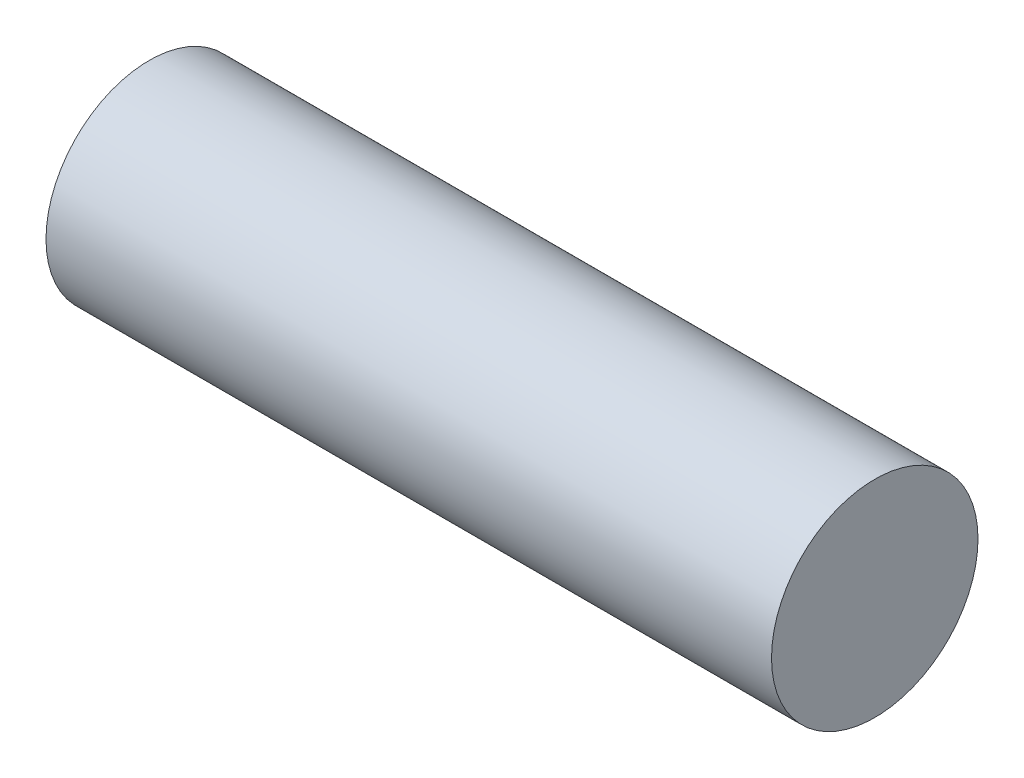
ISO-10303-21;
HEADER;
FILE_DESCRIPTION(('STEP AP214'),'2;1');
FILE_NAME('part.step','',(''),(''),'','','');
FILE_SCHEMA(('AUTOMOTIVE_DESIGN { 1 0 10303 214 1 1 1 1 }'));
ENDSEC;
DATA;
#1=APPLICATION_CONTEXT('core data for automotive mechanical design processes');
#2=APPLICATION_PROTOCOL_DEFINITION('international standard','automotive_design',2000,#1);
#3=PRODUCT_CONTEXT('',#1,'mechanical');
#4=PRODUCT('Part','Part','',(#3));
#5=PRODUCT_RELATED_PRODUCT_CATEGORY('part','',(#4));
#6=PRODUCT_DEFINITION_FORMATION('','',#4);
#7=PRODUCT_DEFINITION_CONTEXT('part definition',#1,'design');
#8=PRODUCT_DEFINITION('design','',#6,#7);
#9=PRODUCT_DEFINITION_SHAPE('','',#8);
#10=(LENGTH_UNIT() NAMED_UNIT(*) SI_UNIT(.MILLI.,.METRE.));
#11=(NAMED_UNIT(*) PLANE_ANGLE_UNIT() SI_UNIT($,.RADIAN.));
#12=(NAMED_UNIT(*) SI_UNIT($,.STERADIAN.) SOLID_ANGLE_UNIT());
#13=UNCERTAINTY_MEASURE_WITH_UNIT(LENGTH_MEASURE(1.E-05),#10,'distance_accuracy_value','');
#14=(GEOMETRIC_REPRESENTATION_CONTEXT(3) GLOBAL_UNCERTAINTY_ASSIGNED_CONTEXT((#13)) GLOBAL_UNIT_ASSIGNED_CONTEXT((#10,
#11,#12)) REPRESENTATION_CONTEXT('',''));
#15=CARTESIAN_POINT('',(0.,0.,0.));
#16=DIRECTION('',(0.,0.,1.));
#17=DIRECTION('',(1.,0.,0.));
#18=AXIS2_PLACEMENT_3D('',#15,#16,#17);
#19=CARTESIAN_POINT('',(32.5,0.,0.));
#20=DIRECTION('',(-1.,0.,0.));
#21=DIRECTION('',(0.,0.,1.));
#22=AXIS2_PLACEMENT_3D('',#19,#20,#21);
#23=CYLINDRICAL_SURFACE('',#22,9.25);
#24=CARTESIAN_POINT('',(32.5,0.,0.));
#25=DIRECTION('',(1.,0.,0.));
#26=DIRECTION('',(0.,0.,-1.));
#27=AXIS2_PLACEMENT_3D('',#24,#25,#26);
#28=CIRCLE('',#27,9.25);
#29=CARTESIAN_POINT('',(32.5,0.,-9.25));
#30=VERTEX_POINT('',#29);
#31=EDGE_CURVE('E10',#30,#30,#28,.T.);
#32=ORIENTED_EDGE('',*,*,#31,.F.);
#33=EDGE_LOOP('',(#32));
#34=FACE_BOUND('',#33,.T.);
#35=CARTESIAN_POINT('',(-32.5,0.,0.));
#36=DIRECTION('',(1.,0.,0.));
#37=DIRECTION('',(0.,0.,-1.));
#38=AXIS2_PLACEMENT_3D('',#35,#36,#37);
#39=CIRCLE('',#38,9.25);
#40=CARTESIAN_POINT('',(-32.5,0.,-9.25));
#41=VERTEX_POINT('',#40);
#42=EDGE_CURVE('E33',#41,#41,#39,.T.);
#43=ORIENTED_EDGE('',*,*,#42,.T.);
#44=EDGE_LOOP('',(#43));
#45=FACE_BOUND('',#44,.T.);
#46=ADVANCED_FACE('F30',(#34,#45),#23,.T.);
#47=CARTESIAN_POINT('',(32.5,0.,0.));
#48=DIRECTION('',(1.,0.,0.));
#49=DIRECTION('',(0.,0.,-1.));
#50=AXIS2_PLACEMENT_3D('',#47,#48,#49);
#51=PLANE('',#50);
#52=ORIENTED_EDGE('',*,*,#31,.T.);
#53=EDGE_LOOP('',(#52));
#54=FACE_BOUND('',#53,.T.);
#55=ADVANCED_FACE('F45',(#54),#51,.T.);
#56=CARTESIAN_POINT('',(-32.5,0.,0.));
#57=DIRECTION('',(1.,0.,0.));
#58=DIRECTION('',(0.,0.,-1.));
#59=AXIS2_PLACEMENT_3D('',#56,#57,#58);
#60=PLANE('',#59);
#61=ORIENTED_EDGE('',*,*,#42,.F.);
#62=EDGE_LOOP('',(#61));
#63=FACE_BOUND('',#62,.T.);
#64=ADVANCED_FACE('F43',(#63),#60,.F.);
#65=CLOSED_SHELL('',(#46,#55,#64));
#66=MANIFOLD_SOLID_BREP('B2',#65);
#67=ADVANCED_BREP_SHAPE_REPRESENTATION('',(#18,#66),#14);
#68=SHAPE_DEFINITION_REPRESENTATION(#9,#67);
ENDSEC;
END-ISO-10303-21;
